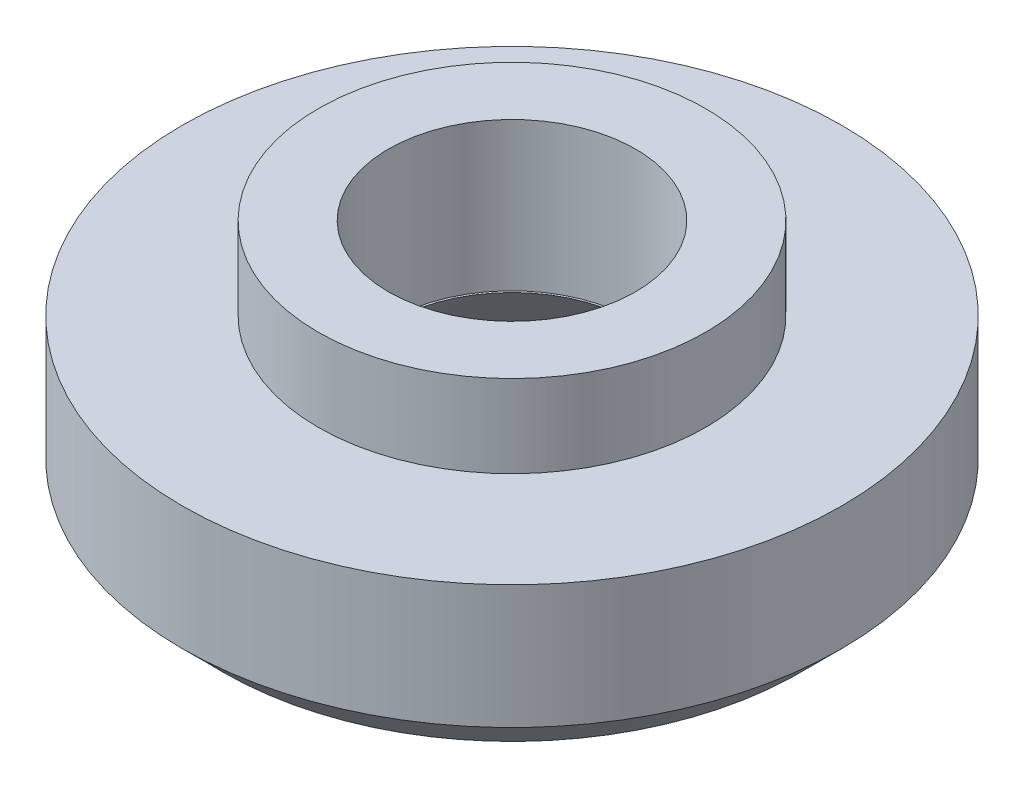
ISO-10303-21;
HEADER;
FILE_DESCRIPTION(('STEP AP214'),'2;1');
FILE_NAME('part.step','',(''),(''),'','','');
FILE_SCHEMA(('AUTOMOTIVE_DESIGN { 1 0 10303 214 1 1 1 1 }'));
ENDSEC;
DATA;
#1=APPLICATION_CONTEXT('core data for automotive mechanical design processes');
#2=APPLICATION_PROTOCOL_DEFINITION('international standard','automotive_design',2000,#1);
#3=PRODUCT_CONTEXT('',#1,'mechanical');
#4=PRODUCT('Part','Part','',(#3));
#5=PRODUCT_RELATED_PRODUCT_CATEGORY('part','',(#4));
#6=PRODUCT_DEFINITION_FORMATION('','',#4);
#7=PRODUCT_DEFINITION_CONTEXT('part definition',#1,'design');
#8=PRODUCT_DEFINITION('design','',#6,#7);
#9=PRODUCT_DEFINITION_SHAPE('','',#8);
#10=(LENGTH_UNIT() NAMED_UNIT(*) SI_UNIT(.MILLI.,.METRE.));
#11=(NAMED_UNIT(*) PLANE_ANGLE_UNIT() SI_UNIT($,.RADIAN.));
#12=(NAMED_UNIT(*) SI_UNIT($,.STERADIAN.) SOLID_ANGLE_UNIT());
#13=UNCERTAINTY_MEASURE_WITH_UNIT(LENGTH_MEASURE(1.E-05),#10,'distance_accuracy_value','');
#14=(GEOMETRIC_REPRESENTATION_CONTEXT(3) GLOBAL_UNCERTAINTY_ASSIGNED_CONTEXT((#13)) GLOBAL_UNIT_ASSIGNED_CONTEXT((#10,
#11,#12)) REPRESENTATION_CONTEXT('',''));
#15=CARTESIAN_POINT('',(0.,0.,0.));
#16=DIRECTION('',(0.,0.,1.));
#17=DIRECTION('',(1.,0.,0.));
#18=AXIS2_PLACEMENT_3D('',#15,#16,#17);
#19=CARTESIAN_POINT('',(0.,-2.,0.));
#20=DIRECTION('',(0.,-1.,0.));
#21=DIRECTION('',(0.,0.,-1.));
#22=AXIS2_PLACEMENT_3D('',#19,#20,#21);
#23=CONICAL_SURFACE('',#22,2.675,0.78539816339745);
#24=CARTESIAN_POINT('',(0.,-2.,0.));
#25=DIRECTION('',(0.,-1.,0.));
#26=DIRECTION('',(0.,0.,-1.));
#27=AXIS2_PLACEMENT_3D('',#24,#25,#26);
#28=CIRCLE('',#27,2.675);
#29=CARTESIAN_POINT('',(0.,-2.,-2.675));
#30=VERTEX_POINT('',#29);
#31=EDGE_CURVE('E77',#30,#30,#28,.T.);
#32=ORIENTED_EDGE('',*,*,#31,.T.);
#33=EDGE_LOOP('',(#32));
#34=FACE_BOUND('',#33,.T.);
#35=CARTESIAN_POINT('',(0.,-0.8,0.));
#36=DIRECTION('',(0.,1.,0.));
#37=DIRECTION('',(0.,0.,1.));
#38=AXIS2_PLACEMENT_3D('',#35,#36,#37);
#39=CIRCLE('',#38,1.475);
#40=CARTESIAN_POINT('',(0.,-0.8,1.475));
#41=VERTEX_POINT('',#40);
#42=EDGE_CURVE('E74',#41,#41,#39,.F.);
#43=ORIENTED_EDGE('',*,*,#42,.F.);
#44=EDGE_LOOP('',(#43));
#45=FACE_BOUND('',#44,.T.);
#46=ADVANCED_FACE('F49',(#34,#45),#23,.F.);
#47=CARTESIAN_POINT('',(0.,1.,0.));
#48=DIRECTION('',(0.,-1.,0.));
#49=DIRECTION('',(0.,0.,-1.));
#50=AXIS2_PLACEMENT_3D('',#47,#48,#49);
#51=CYLINDRICAL_SURFACE('',#50,2.35);
#52=CARTESIAN_POINT('',(0.,1.,0.));
#53=DIRECTION('',(0.,1.,0.));
#54=DIRECTION('',(0.,0.,1.));
#55=AXIS2_PLACEMENT_3D('',#52,#53,#54);
#56=CIRCLE('',#55,2.35);
#57=CARTESIAN_POINT('',(0.,1.,2.35));
#58=VERTEX_POINT('',#57);
#59=EDGE_CURVE('E65',#58,#58,#56,.T.);
#60=ORIENTED_EDGE('',*,*,#59,.F.);
#61=EDGE_LOOP('',(#60));
#62=FACE_BOUND('',#61,.T.);
#63=CARTESIAN_POINT('',(0.,0.,0.));
#64=DIRECTION('',(0.,1.,0.));
#65=DIRECTION('',(0.,0.,1.));
#66=AXIS2_PLACEMENT_3D('',#63,#64,#65);
#67=CIRCLE('',#66,2.35);
#68=CARTESIAN_POINT('',(0.,0.,2.35));
#69=VERTEX_POINT('',#68);
#70=EDGE_CURVE('E71',#69,#69,#67,.T.);
#71=ORIENTED_EDGE('',*,*,#70,.T.);
#72=EDGE_LOOP('',(#71));
#73=FACE_BOUND('',#72,.T.);
#74=ADVANCED_FACE('F108',(#62,#73),#51,.T.);
#75=CARTESIAN_POINT('',(0.,1.,0.));
#76=DIRECTION('',(0.,1.,0.));
#77=DIRECTION('',(0.,0.,1.));
#78=AXIS2_PLACEMENT_3D('',#75,#76,#77);
#79=PLANE('',#78);
#80=CARTESIAN_POINT('',(0.,1.,0.));
#81=DIRECTION('',(0.,1.,0.));
#82=DIRECTION('',(0.,0.,1.));
#83=AXIS2_PLACEMENT_3D('',#80,#81,#82);
#84=CIRCLE('',#83,1.5);
#85=CARTESIAN_POINT('',(0.,1.,1.5));
#86=VERTEX_POINT('',#85);
#87=EDGE_CURVE('E87',#86,#86,#84,.T.);
#88=ORIENTED_EDGE('',*,*,#87,.F.);
#89=EDGE_LOOP('',(#88));
#90=FACE_BOUND('',#89,.T.);
#91=ORIENTED_EDGE('',*,*,#59,.T.);
#92=EDGE_LOOP('',(#91));
#93=FACE_BOUND('',#92,.T.);
#94=ADVANCED_FACE('F104',(#90,#93),#79,.T.);
#95=CARTESIAN_POINT('',(0.,-2.,0.));
#96=DIRECTION('',(0.,1.,0.));
#97=DIRECTION('',(0.,0.,1.));
#98=AXIS2_PLACEMENT_3D('',#95,#96,#97);
#99=CYLINDRICAL_SURFACE('',#98,4.);
#100=CARTESIAN_POINT('',(0.,-1.5,0.));
#101=DIRECTION('',(0.,-1.,0.));
#102=DIRECTION('',(0.,0.,-1.));
#103=AXIS2_PLACEMENT_3D('',#100,#101,#102);
#104=CIRCLE('',#103,4.);
#105=CARTESIAN_POINT('',(0.,-1.5,-4.));
#106=VERTEX_POINT('',#105);
#107=EDGE_CURVE('E10',#106,#106,#104,.F.);
#108=ORIENTED_EDGE('',*,*,#107,.T.);
#109=EDGE_LOOP('',(#108));
#110=FACE_BOUND('',#109,.T.);
#111=CARTESIAN_POINT('',(0.,0.,0.));
#112=DIRECTION('',(0.,-1.,0.));
#113=DIRECTION('',(0.,0.,-1.));
#114=AXIS2_PLACEMENT_3D('',#111,#112,#113);
#115=CIRCLE('',#114,4.);
#116=CARTESIAN_POINT('',(0.,0.,-4.));
#117=VERTEX_POINT('',#116);
#118=EDGE_CURVE('E81',#117,#117,#115,.T.);
#119=ORIENTED_EDGE('',*,*,#118,.T.);
#120=EDGE_LOOP('',(#119));
#121=FACE_BOUND('',#120,.T.);
#122=ADVANCED_FACE('F107',(#110,#121),#99,.T.);
#123=CARTESIAN_POINT('',(0.,-2.,0.));
#124=DIRECTION('',(0.,-1.,0.));
#125=DIRECTION('',(0.,0.,-1.));
#126=AXIS2_PLACEMENT_3D('',#123,#124,#125);
#127=PLANE('',#126);
#128=CARTESIAN_POINT('',(0.,-2.,0.));
#129=DIRECTION('',(0.,-1.,0.));
#130=DIRECTION('',(0.,0.,-1.));
#131=AXIS2_PLACEMENT_3D('',#128,#129,#130);
#132=CIRCLE('',#131,3.5);
#133=CARTESIAN_POINT('',(0.,-2.,-3.5));
#134=VERTEX_POINT('',#133);
#135=EDGE_CURVE('E58',#134,#134,#132,.T.);
#136=ORIENTED_EDGE('',*,*,#135,.T.);
#137=EDGE_LOOP('',(#136));
#138=FACE_BOUND('',#137,.T.);
#139=ORIENTED_EDGE('',*,*,#31,.F.);
#140=EDGE_LOOP('',(#139));
#141=FACE_BOUND('',#140,.T.);
#142=ADVANCED_FACE('F119',(#138,#141),#127,.T.);
#143=CARTESIAN_POINT('',(0.,0.,0.));
#144=DIRECTION('',(0.,-1.,0.));
#145=DIRECTION('',(0.,0.,-1.));
#146=AXIS2_PLACEMENT_3D('',#143,#144,#145);
#147=PLANE('',#146);
#148=ORIENTED_EDGE('',*,*,#70,.F.);
#149=EDGE_LOOP('',(#148));
#150=FACE_BOUND('',#149,.T.);
#151=ORIENTED_EDGE('',*,*,#118,.F.);
#152=EDGE_LOOP('',(#151));
#153=FACE_BOUND('',#152,.T.);
#154=ADVANCED_FACE('F116',(#150,#153),#147,.F.);
#155=CARTESIAN_POINT('',(0.,-0.8,0.));
#156=DIRECTION('',(0.,1.,0.));
#157=DIRECTION('',(0.,0.,1.));
#158=AXIS2_PLACEMENT_3D('',#155,#156,#157);
#159=PLANE('',#158);
#160=CARTESIAN_POINT('',(0.,-0.8,0.));
#161=DIRECTION('',(0.,1.,0.));
#162=DIRECTION('',(0.,0.,1.));
#163=AXIS2_PLACEMENT_3D('',#160,#161,#162);
#164=CIRCLE('',#163,1.5);
#165=CARTESIAN_POINT('',(0.,-0.8,1.5));
#166=VERTEX_POINT('',#165);
#167=EDGE_CURVE('E78',#166,#166,#164,.T.);
#168=ORIENTED_EDGE('',*,*,#167,.T.);
#169=EDGE_LOOP('',(#168));
#170=FACE_BOUND('',#169,.T.);
#171=ORIENTED_EDGE('',*,*,#42,.T.);
#172=EDGE_LOOP('',(#171));
#173=FACE_BOUND('',#172,.T.);
#174=ADVANCED_FACE('F95',(#170,#173),#159,.T.);
#175=CARTESIAN_POINT('',(0.,-0.8,0.));
#176=DIRECTION('',(0.,1.,0.));
#177=DIRECTION('',(0.,0.,1.));
#178=AXIS2_PLACEMENT_3D('',#175,#176,#177);
#179=CYLINDRICAL_SURFACE('',#178,1.5);
#180=ORIENTED_EDGE('',*,*,#167,.F.);
#181=EDGE_LOOP('',(#180));
#182=FACE_BOUND('',#181,.T.);
#183=ORIENTED_EDGE('',*,*,#87,.T.);
#184=EDGE_LOOP('',(#183));
#185=FACE_BOUND('',#184,.T.);
#186=ADVANCED_FACE('F98',(#182,#185),#179,.F.);
#187=CARTESIAN_POINT('',(0.,-2.,0.));
#188=DIRECTION('',(0.,1.,0.));
#189=DIRECTION('',(0.,0.,1.));
#190=AXIS2_PLACEMENT_3D('',#187,#188,#189);
#191=CONICAL_SURFACE('',#190,3.5,0.785398163397447);
#192=ORIENTED_EDGE('',*,*,#107,.F.);
#193=EDGE_LOOP('',(#192));
#194=FACE_BOUND('',#193,.T.);
#195=ORIENTED_EDGE('',*,*,#135,.F.);
#196=EDGE_LOOP('',(#195));
#197=FACE_BOUND('',#196,.T.);
#198=ADVANCED_FACE('F52',(#194,#197),#191,.T.);
#199=CLOSED_SHELL('',(#46,#74,#94,#122,#142,#154,#174,#186,#198));
#200=MANIFOLD_SOLID_BREP('B2',#199);
#201=ADVANCED_BREP_SHAPE_REPRESENTATION('',(#18,#200),#14);
#202=SHAPE_DEFINITION_REPRESENTATION(#9,#201);
ENDSEC;
END-ISO-10303-21;
